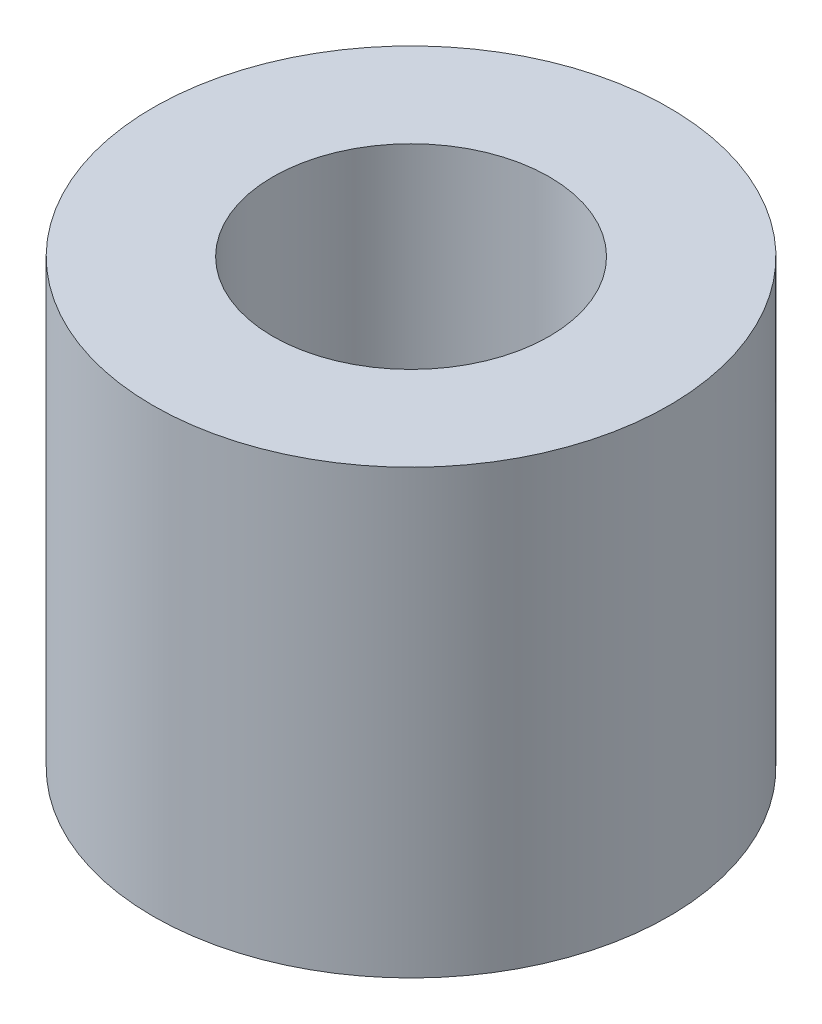
ISO-10303-21;
HEADER;
FILE_DESCRIPTION(('STEP AP214'),'2;1');
FILE_NAME('part.step','',(''),(''),'','','');
FILE_SCHEMA(('AUTOMOTIVE_DESIGN { 1 0 10303 214 1 1 1 1 }'));
ENDSEC;
DATA;
#1=APPLICATION_CONTEXT('core data for automotive mechanical design processes');
#2=APPLICATION_PROTOCOL_DEFINITION('international standard','automotive_design',2000,#1);
#3=PRODUCT_CONTEXT('',#1,'mechanical');
#4=PRODUCT('Part','Part','',(#3));
#5=PRODUCT_RELATED_PRODUCT_CATEGORY('part','',(#4));
#6=PRODUCT_DEFINITION_FORMATION('','',#4);
#7=PRODUCT_DEFINITION_CONTEXT('part definition',#1,'design');
#8=PRODUCT_DEFINITION('design','',#6,#7);
#9=PRODUCT_DEFINITION_SHAPE('','',#8);
#10=(LENGTH_UNIT() NAMED_UNIT(*) SI_UNIT(.MILLI.,.METRE.));
#11=(NAMED_UNIT(*) PLANE_ANGLE_UNIT() SI_UNIT($,.RADIAN.));
#12=(NAMED_UNIT(*) SI_UNIT($,.STERADIAN.) SOLID_ANGLE_UNIT());
#13=UNCERTAINTY_MEASURE_WITH_UNIT(LENGTH_MEASURE(1.E-05),#10,'distance_accuracy_value','');
#14=(GEOMETRIC_REPRESENTATION_CONTEXT(3) GLOBAL_UNCERTAINTY_ASSIGNED_CONTEXT((#13)) GLOBAL_UNIT_ASSIGNED_CONTEXT((#10,
#11,#12)) REPRESENTATION_CONTEXT('',''));
#15=CARTESIAN_POINT('',(0.,0.,0.));
#16=DIRECTION('',(0.,0.,1.));
#17=DIRECTION('',(1.,0.,0.));
#18=AXIS2_PLACEMENT_3D('',#15,#16,#17);
#19=CARTESIAN_POINT('',(0.,6.,0.));
#20=DIRECTION('',(0.,1.,0.));
#21=DIRECTION('',(0.,0.,1.));
#22=AXIS2_PLACEMENT_3D('',#19,#20,#21);
#23=PLANE('',#22);
#24=CARTESIAN_POINT('',(0.,6.,0.));
#25=DIRECTION('',(0.,1.,0.));
#26=DIRECTION('',(0.,0.,1.));
#27=AXIS2_PLACEMENT_3D('',#24,#25,#26);
#28=CIRCLE('',#27,3.5);
#29=CARTESIAN_POINT('',(0.,6.,3.5));
#30=VERTEX_POINT('',#29);
#31=EDGE_CURVE('E10',#30,#30,#28,.T.);
#32=ORIENTED_EDGE('',*,*,#31,.T.);
#33=EDGE_LOOP('',(#32));
#34=FACE_BOUND('',#33,.T.);
#35=CARTESIAN_POINT('',(0.,6.,0.));
#36=DIRECTION('',(0.,1.,0.));
#37=DIRECTION('',(0.,0.,1.));
#38=AXIS2_PLACEMENT_3D('',#35,#36,#37);
#39=CIRCLE('',#38,1.875);
#40=CARTESIAN_POINT('',(0.,6.,1.875));
#41=VERTEX_POINT('',#40);
#42=EDGE_CURVE('E44',#41,#41,#39,.T.);
#43=ORIENTED_EDGE('',*,*,#42,.F.);
#44=EDGE_LOOP('',(#43));
#45=FACE_BOUND('',#44,.T.);
#46=ADVANCED_FACE('F33',(#34,#45),#23,.T.);
#47=CARTESIAN_POINT('',(0.,0.,0.));
#48=DIRECTION('',(0.,1.,0.));
#49=DIRECTION('',(0.,0.,1.));
#50=AXIS2_PLACEMENT_3D('',#47,#48,#49);
#51=PLANE('',#50);
#52=CARTESIAN_POINT('',(0.,0.,0.));
#53=DIRECTION('',(0.,1.,0.));
#54=DIRECTION('',(0.,0.,1.));
#55=AXIS2_PLACEMENT_3D('',#52,#53,#54);
#56=CIRCLE('',#55,3.5);
#57=CARTESIAN_POINT('',(0.,0.,3.5));
#58=VERTEX_POINT('',#57);
#59=EDGE_CURVE('E37',#58,#58,#56,.T.);
#60=ORIENTED_EDGE('',*,*,#59,.F.);
#61=EDGE_LOOP('',(#60));
#62=FACE_BOUND('',#61,.T.);
#63=CARTESIAN_POINT('',(0.,0.,0.));
#64=DIRECTION('',(0.,1.,0.));
#65=DIRECTION('',(0.,0.,1.));
#66=AXIS2_PLACEMENT_3D('',#63,#64,#65);
#67=CIRCLE('',#66,1.875);
#68=CARTESIAN_POINT('',(0.,0.,1.875));
#69=VERTEX_POINT('',#68);
#70=EDGE_CURVE('E46',#69,#69,#67,.T.);
#71=ORIENTED_EDGE('',*,*,#70,.T.);
#72=EDGE_LOOP('',(#71));
#73=FACE_BOUND('',#72,.T.);
#74=ADVANCED_FACE('F56',(#62,#73),#51,.F.);
#75=CARTESIAN_POINT('',(0.,6.,0.));
#76=DIRECTION('',(0.,-1.,0.));
#77=DIRECTION('',(0.,0.,-1.));
#78=AXIS2_PLACEMENT_3D('',#75,#76,#77);
#79=CYLINDRICAL_SURFACE('',#78,3.5);
#80=ORIENTED_EDGE('',*,*,#31,.F.);
#81=EDGE_LOOP('',(#80));
#82=FACE_BOUND('',#81,.T.);
#83=ORIENTED_EDGE('',*,*,#59,.T.);
#84=EDGE_LOOP('',(#83));
#85=FACE_BOUND('',#84,.T.);
#86=ADVANCED_FACE('F35',(#82,#85),#79,.T.);
#87=CARTESIAN_POINT('',(0.,6.,0.));
#88=DIRECTION('',(0.,-1.,0.));
#89=DIRECTION('',(0.,0.,-1.));
#90=AXIS2_PLACEMENT_3D('',#87,#88,#89);
#91=CYLINDRICAL_SURFACE('',#90,1.875);
#92=ORIENTED_EDGE('',*,*,#42,.T.);
#93=EDGE_LOOP('',(#92));
#94=FACE_BOUND('',#93,.T.);
#95=ORIENTED_EDGE('',*,*,#70,.F.);
#96=EDGE_LOOP('',(#95));
#97=FACE_BOUND('',#96,.T.);
#98=ADVANCED_FACE('F52',(#94,#97),#91,.F.);
#99=CLOSED_SHELL('',(#46,#74,#86,#98));
#100=MANIFOLD_SOLID_BREP('B2',#99);
#101=ADVANCED_BREP_SHAPE_REPRESENTATION('',(#18,#100),#14);
#102=SHAPE_DEFINITION_REPRESENTATION(#9,#101);
ENDSEC;
END-ISO-10303-21;
